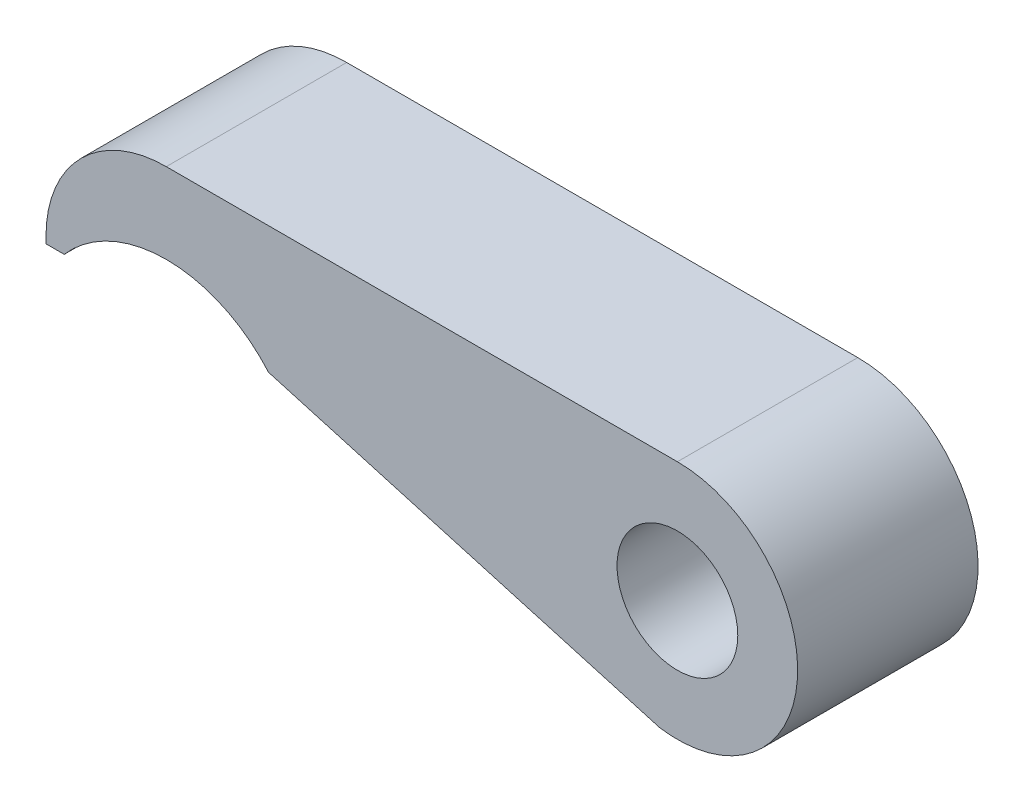
ISO-10303-21;
HEADER;
FILE_DESCRIPTION(('STEP AP214'),'2;1');
FILE_NAME('part.step','',(''),(''),'','','');
FILE_SCHEMA(('AUTOMOTIVE_DESIGN { 1 0 10303 214 1 1 1 1 }'));
ENDSEC;
DATA;
#1=APPLICATION_CONTEXT('core data for automotive mechanical design processes');
#2=APPLICATION_PROTOCOL_DEFINITION('international standard','automotive_design',2000,#1);
#3=PRODUCT_CONTEXT('',#1,'mechanical');
#4=PRODUCT('Part','Part','',(#3));
#5=PRODUCT_RELATED_PRODUCT_CATEGORY('part','',(#4));
#6=PRODUCT_DEFINITION_FORMATION('','',#4);
#7=PRODUCT_DEFINITION_CONTEXT('part definition',#1,'design');
#8=PRODUCT_DEFINITION('design','',#6,#7);
#9=PRODUCT_DEFINITION_SHAPE('','',#8);
#10=(LENGTH_UNIT() NAMED_UNIT(*) SI_UNIT(.MILLI.,.METRE.));
#11=(NAMED_UNIT(*) PLANE_ANGLE_UNIT() SI_UNIT($,.RADIAN.));
#12=(NAMED_UNIT(*) SI_UNIT($,.STERADIAN.) SOLID_ANGLE_UNIT());
#13=UNCERTAINTY_MEASURE_WITH_UNIT(LENGTH_MEASURE(1.E-05),#10,'distance_accuracy_value','');
#14=(GEOMETRIC_REPRESENTATION_CONTEXT(3) GLOBAL_UNCERTAINTY_ASSIGNED_CONTEXT((#13)) GLOBAL_UNIT_ASSIGNED_CONTEXT((#10,
#11,#12)) REPRESENTATION_CONTEXT('',''));
#15=CARTESIAN_POINT('',(0.,0.,0.));
#16=DIRECTION('',(0.,0.,1.));
#17=DIRECTION('',(1.,0.,0.));
#18=AXIS2_PLACEMENT_3D('',#15,#16,#17);
#19=CARTESIAN_POINT('',(-19.84375,-1.01600000000001,-9.525));
#20=DIRECTION('',(-1.,0.,0.));
#21=DIRECTION('',(0.,0.,1.));
#22=AXIS2_PLACEMENT_3D('',#19,#20,#21);
#23=PLANE('',#22);
#24=DIRECTION('',(0.,-1.,0.));
#25=VECTOR('',#24,1.);
#26=CARTESIAN_POINT('',(-19.84375,-1.01600000000001,0.));
#27=LINE('',#26,#25);
#28=CARTESIAN_POINT('',(-19.84375,-0.660400000000051,0.));
#29=VERTEX_POINT('',#28);
#30=CARTESIAN_POINT('',(-19.84375,-1.01600000000001,0.));
#31=VERTEX_POINT('',#30);
#32=EDGE_CURVE('E121',#29,#31,#27,.T.);
#33=ORIENTED_EDGE('',*,*,#32,.F.);
#34=DIRECTION('',(0.,0.,1.));
#35=VECTOR('',#34,1.);
#36=CARTESIAN_POINT('',(-19.84375,-0.660400000000051,-9.525));
#37=LINE('',#36,#35);
#38=CARTESIAN_POINT('',(-19.84375,-0.660400000000051,-9.525));
#39=VERTEX_POINT('',#38);
#40=EDGE_CURVE('E11',#39,#29,#37,.T.);
#41=ORIENTED_EDGE('',*,*,#40,.F.);
#42=DIRECTION('',(0.,-1.,0.));
#43=VECTOR('',#42,1.);
#44=CARTESIAN_POINT('',(-19.84375,-1.01600000000001,-9.525));
#45=LINE('',#44,#43);
#46=CARTESIAN_POINT('',(-19.84375,-1.01600000000001,-9.525));
#47=VERTEX_POINT('',#46);
#48=EDGE_CURVE('E139',#39,#47,#45,.T.);
#49=ORIENTED_EDGE('',*,*,#48,.T.);
#50=DIRECTION('',(0.,0.,1.));
#51=VECTOR('',#50,1.);
#52=CARTESIAN_POINT('',(-19.84375,-1.01600000000001,-9.525));
#53=LINE('',#52,#51);
#54=EDGE_CURVE('E33',#47,#31,#53,.T.);
#55=ORIENTED_EDGE('',*,*,#54,.T.);
#56=EDGE_LOOP('',(#33,#41,#49,#55));
#57=FACE_BOUND('',#56,.T.);
#58=ADVANCED_FACE('F30',(#57),#23,.T.);
#59=CARTESIAN_POINT('',(-13.49375,-0.660400000000006,-9.525));
#60=DIRECTION('',(0.,0.,1.));
#61=DIRECTION('',(1.,0.,0.));
#62=AXIS2_PLACEMENT_3D('',#59,#60,#61);
#63=CYLINDRICAL_SURFACE('',#62,6.35);
#64=CARTESIAN_POINT('',(-13.49375,-0.660400000000006,0.));
#65=DIRECTION('',(0.,0.,1.));
#66=DIRECTION('',(-1.,0.,0.));
#67=AXIS2_PLACEMENT_3D('',#64,#65,#66);
#68=CIRCLE('',#67,6.35);
#69=CARTESIAN_POINT('',(-13.49375,5.68959999999999,0.));
#70=VERTEX_POINT('',#69);
#71=EDGE_CURVE('E137',#70,#29,#68,.T.);
#72=ORIENTED_EDGE('',*,*,#71,.F.);
#73=DIRECTION('',(0.,0.,1.));
#74=VECTOR('',#73,1.);
#75=CARTESIAN_POINT('',(-13.49375,5.68959999999999,-9.525));
#76=LINE('',#75,#74);
#77=CARTESIAN_POINT('',(-13.49375,5.68959999999999,-9.525));
#78=VERTEX_POINT('',#77);
#79=EDGE_CURVE('E39',#78,#70,#76,.T.);
#80=ORIENTED_EDGE('',*,*,#79,.F.);
#81=CARTESIAN_POINT('',(-13.49375,-0.660400000000006,-9.525));
#82=DIRECTION('',(0.,0.,1.));
#83=DIRECTION('',(-1.,0.,0.));
#84=AXIS2_PLACEMENT_3D('',#81,#82,#83);
#85=CIRCLE('',#84,6.35);
#86=EDGE_CURVE('E111',#78,#39,#85,.T.);
#87=ORIENTED_EDGE('',*,*,#86,.T.);
#88=ORIENTED_EDGE('',*,*,#40,.T.);
#89=EDGE_LOOP('',(#72,#80,#87,#88));
#90=FACE_BOUND('',#89,.T.);
#91=ADVANCED_FACE('F149',(#90),#63,.T.);
#92=CARTESIAN_POINT('',(-13.49375,5.68959999999999,-9.525));
#93=DIRECTION('',(0.,1.,0.));
#94=DIRECTION('',(0.,0.,1.));
#95=AXIS2_PLACEMENT_3D('',#92,#93,#94);
#96=PLANE('',#95);
#97=DIRECTION('',(-1.,0.,0.));
#98=VECTOR('',#97,1.);
#99=CARTESIAN_POINT('',(-13.49375,5.68959999999999,0.));
#100=LINE('',#99,#98);
#101=CARTESIAN_POINT('',(13.49375,5.68959999999999,0.));
#102=VERTEX_POINT('',#101);
#103=EDGE_CURVE('E98',#102,#70,#100,.T.);
#104=ORIENTED_EDGE('',*,*,#103,.F.);
#105=DIRECTION('',(0.,0.,1.));
#106=VECTOR('',#105,1.);
#107=CARTESIAN_POINT('',(13.49375,5.68959999999999,-9.525));
#108=LINE('',#107,#106);
#109=CARTESIAN_POINT('',(13.49375,5.68959999999999,-9.525));
#110=VERTEX_POINT('',#109);
#111=EDGE_CURVE('E93',#110,#102,#108,.T.);
#112=ORIENTED_EDGE('',*,*,#111,.F.);
#113=DIRECTION('',(-1.,0.,0.));
#114=VECTOR('',#113,1.);
#115=CARTESIAN_POINT('',(-13.49375,5.68959999999999,-9.525));
#116=LINE('',#115,#114);
#117=EDGE_CURVE('E96',#110,#78,#116,.T.);
#118=ORIENTED_EDGE('',*,*,#117,.T.);
#119=ORIENTED_EDGE('',*,*,#79,.T.);
#120=EDGE_LOOP('',(#104,#112,#118,#119));
#121=FACE_BOUND('',#120,.T.);
#122=ADVANCED_FACE('F95',(#121),#96,.T.);
#123=CARTESIAN_POINT('',(13.49375,-0.660400000000009,-9.525));
#124=DIRECTION('',(0.,0.,1.));
#125=DIRECTION('',(1.,0.,0.));
#126=AXIS2_PLACEMENT_3D('',#123,#124,#125);
#127=CYLINDRICAL_SURFACE('',#126,6.35);
#128=CARTESIAN_POINT('',(13.49375,-0.660400000000009,0.));
#129=DIRECTION('',(0.,0.,1.));
#130=DIRECTION('',(-1.,0.,0.));
#131=AXIS2_PLACEMENT_3D('',#128,#129,#130);
#132=CIRCLE('',#131,6.35);
#133=CARTESIAN_POINT('',(12.5830786254703,-6.94475976433657,0.));
#134=VERTEX_POINT('',#133);
#135=EDGE_CURVE('E134',#134,#102,#132,.T.);
#136=ORIENTED_EDGE('',*,*,#135,.F.);
#137=DIRECTION('',(0.,0.,1.));
#138=VECTOR('',#137,1.);
#139=CARTESIAN_POINT('',(12.5830786254703,-6.94475976433657,-9.525));
#140=LINE('',#139,#138);
#141=CARTESIAN_POINT('',(12.5830786254703,-6.94475976433657,-9.525));
#142=VERTEX_POINT('',#141);
#143=EDGE_CURVE('E103',#142,#134,#140,.T.);
#144=ORIENTED_EDGE('',*,*,#143,.F.);
#145=CARTESIAN_POINT('',(13.49375,-0.660400000000009,-9.525));
#146=DIRECTION('',(0.,0.,1.));
#147=DIRECTION('',(-1.,0.,0.));
#148=AXIS2_PLACEMENT_3D('',#145,#146,#147);
#149=CIRCLE('',#148,6.35);
#150=EDGE_CURVE('E109',#142,#110,#149,.T.);
#151=ORIENTED_EDGE('',*,*,#150,.T.);
#152=ORIENTED_EDGE('',*,*,#111,.T.);
#153=EDGE_LOOP('',(#136,#144,#151,#152));
#154=FACE_BOUND('',#153,.T.);
#155=ADVANCED_FACE('F113',(#154),#127,.T.);
#156=CARTESIAN_POINT('',(-8.09296381073981,-1.01600000000001,-9.525));
#157=DIRECTION('',(-0.275637355817,-0.961261695938319,0.));
#158=DIRECTION('',(0.961261695938319,-0.275637355817,0.));
#159=AXIS2_PLACEMENT_3D('',#156,#157,#158);
#160=PLANE('',#159);
#161=DIRECTION('',(0.961261695938319,-0.275637355817,0.));
#162=VECTOR('',#161,1.);
#163=CARTESIAN_POINT('',(-8.09296381073981,-1.01600000000001,0.));
#164=LINE('',#163,#162);
#165=CARTESIAN_POINT('',(-8.09296381073981,-1.01600000000001,0.));
#166=VERTEX_POINT('',#165);
#167=EDGE_CURVE('E131',#166,#134,#164,.T.);
#168=ORIENTED_EDGE('',*,*,#167,.F.);
#169=DIRECTION('',(0.,0.,1.));
#170=VECTOR('',#169,1.);
#171=CARTESIAN_POINT('',(-8.09296381073981,-1.01600000000001,-9.525));
#172=LINE('',#171,#170);
#173=CARTESIAN_POINT('',(-8.09296381073981,-1.01600000000001,-9.525));
#174=VERTEX_POINT('',#173);
#175=EDGE_CURVE('E143',#174,#166,#172,.T.);
#176=ORIENTED_EDGE('',*,*,#175,.F.);
#177=DIRECTION('',(0.961261695938319,-0.275637355817,0.));
#178=VECTOR('',#177,1.);
#179=CARTESIAN_POINT('',(-8.09296381073981,-1.01600000000001,-9.525));
#180=LINE('',#179,#178);
#181=EDGE_CURVE('E114',#174,#142,#180,.T.);
#182=ORIENTED_EDGE('',*,*,#181,.T.);
#183=ORIENTED_EDGE('',*,*,#143,.T.);
#184=EDGE_LOOP('',(#168,#176,#182,#183));
#185=FACE_BOUND('',#184,.T.);
#186=ADVANCED_FACE('F162',(#185),#160,.T.);
#187=CARTESIAN_POINT('',(-13.4874,-5.68960000000001,-9.525));
#188=DIRECTION('',(0.,0.,1.));
#189=DIRECTION('',(1.,0.,0.));
#190=AXIS2_PLACEMENT_3D('',#187,#188,#189);
#191=CYLINDRICAL_SURFACE('',#190,7.1374);
#192=CARTESIAN_POINT('',(-13.4874,-5.68960000000001,0.));
#193=DIRECTION('',(0.,0.,-1.));
#194=DIRECTION('',(-1.,0.,0.));
#195=AXIS2_PLACEMENT_3D('',#192,#193,#194);
#196=CIRCLE('',#195,7.1374);
#197=CARTESIAN_POINT('',(-18.8818361892602,-1.01600000000001,0.));
#198=VERTEX_POINT('',#197);
#199=EDGE_CURVE('E128',#198,#166,#196,.T.);
#200=ORIENTED_EDGE('',*,*,#199,.F.);
#201=DIRECTION('',(0.,0.,1.));
#202=VECTOR('',#201,1.);
#203=CARTESIAN_POINT('',(-18.8818361892602,-1.01600000000001,-9.525));
#204=LINE('',#203,#202);
#205=CARTESIAN_POINT('',(-18.8818361892602,-1.01600000000001,-9.525));
#206=VERTEX_POINT('',#205);
#207=EDGE_CURVE('E144',#206,#198,#204,.T.);
#208=ORIENTED_EDGE('',*,*,#207,.F.);
#209=CARTESIAN_POINT('',(-13.4874,-5.68960000000001,-9.525));
#210=DIRECTION('',(0.,0.,-1.));
#211=DIRECTION('',(-1.,0.,0.));
#212=AXIS2_PLACEMENT_3D('',#209,#210,#211);
#213=CIRCLE('',#212,7.1374);
#214=EDGE_CURVE('E116',#206,#174,#213,.T.);
#215=ORIENTED_EDGE('',*,*,#214,.T.);
#216=ORIENTED_EDGE('',*,*,#175,.T.);
#217=EDGE_LOOP('',(#200,#208,#215,#216));
#218=FACE_BOUND('',#217,.T.);
#219=ADVANCED_FACE('F165',(#218),#191,.F.);
#220=CARTESIAN_POINT('',(-19.84375,-1.01600000000001,-9.525));
#221=DIRECTION('',(0.,-1.,0.));
#222=DIRECTION('',(1.,0.,0.));
#223=AXIS2_PLACEMENT_3D('',#220,#221,#222);
#224=PLANE('',#223);
#225=DIRECTION('',(1.,0.,0.));
#226=VECTOR('',#225,1.);
#227=CARTESIAN_POINT('',(-19.84375,-1.01600000000001,0.));
#228=LINE('',#227,#226);
#229=EDGE_CURVE('E124',#31,#198,#228,.T.);
#230=ORIENTED_EDGE('',*,*,#229,.F.);
#231=ORIENTED_EDGE('',*,*,#54,.F.);
#232=DIRECTION('',(1.,0.,0.));
#233=VECTOR('',#232,1.);
#234=CARTESIAN_POINT('',(-19.84375,-1.01600000000001,-9.525));
#235=LINE('',#234,#233);
#236=EDGE_CURVE('E194',#47,#206,#235,.T.);
#237=ORIENTED_EDGE('',*,*,#236,.T.);
#238=ORIENTED_EDGE('',*,*,#207,.T.);
#239=EDGE_LOOP('',(#230,#231,#237,#238));
#240=FACE_BOUND('',#239,.T.);
#241=ADVANCED_FACE('F146',(#240),#224,.T.);
#242=CARTESIAN_POINT('',(-13.49375,-0.660400000000006,-9.525));
#243=DIRECTION('',(0.,0.,-1.));
#244=DIRECTION('',(-1.,0.,0.));
#245=AXIS2_PLACEMENT_3D('',#242,#243,#244);
#246=PLANE('',#245);
#247=CARTESIAN_POINT('',(13.49375,-0.660400000000006,-9.525));
#248=DIRECTION('',(0.,0.,1.));
#249=DIRECTION('',(1.,0.,0.));
#250=AXIS2_PLACEMENT_3D('',#247,#248,#249);
#251=CIRCLE('',#250,3.1877);
#252=CARTESIAN_POINT('',(16.68145,-0.660400000000006,-9.525));
#253=VERTEX_POINT('',#252);
#254=EDGE_CURVE('E125',#253,#253,#251,.T.);
#255=ORIENTED_EDGE('',*,*,#254,.T.);
#256=EDGE_LOOP('',(#255));
#257=FACE_BOUND('',#256,.T.);
#258=ORIENTED_EDGE('',*,*,#48,.F.);
#259=ORIENTED_EDGE('',*,*,#86,.F.);
#260=ORIENTED_EDGE('',*,*,#117,.F.);
#261=ORIENTED_EDGE('',*,*,#150,.F.);
#262=ORIENTED_EDGE('',*,*,#181,.F.);
#263=ORIENTED_EDGE('',*,*,#214,.F.);
#264=ORIENTED_EDGE('',*,*,#236,.F.);
#265=EDGE_LOOP('',(#258,#259,#260,#261,#262,#263,#264));
#266=FACE_BOUND('',#265,.T.);
#267=ADVANCED_FACE('F107',(#257,#266),#246,.T.);
#268=CARTESIAN_POINT('',(-13.49375,-0.660400000000006,0.));
#269=DIRECTION('',(0.,0.,-1.));
#270=DIRECTION('',(-1.,0.,0.));
#271=AXIS2_PLACEMENT_3D('',#268,#269,#270);
#272=PLANE('',#271);
#273=CARTESIAN_POINT('',(13.49375,-0.660400000000006,0.));
#274=DIRECTION('',(0.,0.,1.));
#275=DIRECTION('',(1.,0.,0.));
#276=AXIS2_PLACEMENT_3D('',#273,#274,#275);
#277=CIRCLE('',#276,3.1877);
#278=CARTESIAN_POINT('',(16.68145,-0.660400000000006,0.));
#279=VERTEX_POINT('',#278);
#280=EDGE_CURVE('E189',#279,#279,#277,.T.);
#281=ORIENTED_EDGE('',*,*,#280,.F.);
#282=EDGE_LOOP('',(#281));
#283=FACE_BOUND('',#282,.T.);
#284=ORIENTED_EDGE('',*,*,#32,.T.);
#285=ORIENTED_EDGE('',*,*,#229,.T.);
#286=ORIENTED_EDGE('',*,*,#199,.T.);
#287=ORIENTED_EDGE('',*,*,#167,.T.);
#288=ORIENTED_EDGE('',*,*,#135,.T.);
#289=ORIENTED_EDGE('',*,*,#103,.T.);
#290=ORIENTED_EDGE('',*,*,#71,.T.);
#291=EDGE_LOOP('',(#284,#285,#286,#287,#288,#289,#290));
#292=FACE_BOUND('',#291,.T.);
#293=ADVANCED_FACE('F148',(#283,#292),#272,.F.);
#294=CARTESIAN_POINT('',(13.49375,-0.660400000000006,-9.525));
#295=DIRECTION('',(0.,0.,1.));
#296=DIRECTION('',(1.,0.,0.));
#297=AXIS2_PLACEMENT_3D('',#294,#295,#296);
#298=CYLINDRICAL_SURFACE('',#297,3.1877);
#299=CARTESIAN_POINT('',(16.68145,-0.660400000000006,-9.525));
#300=CARTESIAN_POINT('',(16.68145,-0.660400000000006,-9.42578125));
#301=CARTESIAN_POINT('',(16.68145,-0.660400000000006,-9.3265625));
#302=CARTESIAN_POINT('',(16.68145,-0.660400000000006,-9.128125));
#303=CARTESIAN_POINT('',(16.68145,-0.660400000000006,-9.02890625));
#304=CARTESIAN_POINT('',(16.68145,-0.660400000000006,-8.83046875));
#305=CARTESIAN_POINT('',(16.68145,-0.660400000000006,-8.73125));
#306=CARTESIAN_POINT('',(16.68145,-0.660400000000006,-8.5328125));
#307=CARTESIAN_POINT('',(16.68145,-0.660400000000006,-8.43359375));
#308=CARTESIAN_POINT('',(16.68145,-0.660400000000006,-8.23515625));
#309=CARTESIAN_POINT('',(16.68145,-0.660400000000006,-8.1359375));
#310=CARTESIAN_POINT('',(16.68145,-0.660400000000006,-7.9375));
#311=CARTESIAN_POINT('',(16.68145,-0.660400000000006,-7.83828125));
#312=CARTESIAN_POINT('',(16.68145,-0.660400000000006,-7.63984375));
#313=CARTESIAN_POINT('',(16.68145,-0.660400000000006,-7.540625));
#314=CARTESIAN_POINT('',(16.68145,-0.660400000000006,-7.3421875));
#315=CARTESIAN_POINT('',(16.68145,-0.660400000000006,-7.24296875));
#316=CARTESIAN_POINT('',(16.68145,-0.660400000000006,-7.04453125));
#317=CARTESIAN_POINT('',(16.68145,-0.660400000000006,-6.9453125));
#318=CARTESIAN_POINT('',(16.68145,-0.660400000000006,-6.746875));
#319=CARTESIAN_POINT('',(16.68145,-0.660400000000006,-6.64765625));
#320=CARTESIAN_POINT('',(16.68145,-0.660400000000006,-6.44921875));
#321=CARTESIAN_POINT('',(16.68145,-0.660400000000006,-6.35));
#322=CARTESIAN_POINT('',(16.68145,-0.660400000000006,-6.1515625));
#323=CARTESIAN_POINT('',(16.68145,-0.660400000000006,-6.05234375));
#324=CARTESIAN_POINT('',(16.68145,-0.660400000000006,-5.85390625));
#325=CARTESIAN_POINT('',(16.68145,-0.660400000000006,-5.7546875));
#326=CARTESIAN_POINT('',(16.68145,-0.660400000000006,-5.55625));
#327=CARTESIAN_POINT('',(16.68145,-0.660400000000006,-5.45703125));
#328=CARTESIAN_POINT('',(16.68145,-0.660400000000006,-5.25859375));
#329=CARTESIAN_POINT('',(16.68145,-0.660400000000006,-5.159375));
#330=CARTESIAN_POINT('',(16.68145,-0.660400000000006,-4.9609375));
#331=CARTESIAN_POINT('',(16.68145,-0.660400000000006,-4.86171875));
#332=CARTESIAN_POINT('',(16.68145,-0.660400000000006,-4.66328125));
#333=CARTESIAN_POINT('',(16.68145,-0.660400000000006,-4.5640625));
#334=CARTESIAN_POINT('',(16.68145,-0.660400000000006,-4.365625));
#335=CARTESIAN_POINT('',(16.68145,-0.660400000000006,-4.26640625));
#336=CARTESIAN_POINT('',(16.68145,-0.660400000000006,-4.06796875));
#337=CARTESIAN_POINT('',(16.68145,-0.660400000000006,-3.96875));
#338=CARTESIAN_POINT('',(16.68145,-0.660400000000006,-3.7703125));
#339=CARTESIAN_POINT('',(16.68145,-0.660400000000006,-3.67109375));
#340=CARTESIAN_POINT('',(16.68145,-0.660400000000006,-3.47265625));
#341=CARTESIAN_POINT('',(16.68145,-0.660400000000006,-3.3734375));
#342=CARTESIAN_POINT('',(16.68145,-0.660400000000006,-3.175));
#343=CARTESIAN_POINT('',(16.68145,-0.660400000000006,-3.07578125));
#344=CARTESIAN_POINT('',(16.68145,-0.660400000000006,-2.87734375));
#345=CARTESIAN_POINT('',(16.68145,-0.660400000000006,-2.778125));
#346=CARTESIAN_POINT('',(16.68145,-0.660400000000006,-2.5796875));
#347=CARTESIAN_POINT('',(16.68145,-0.660400000000006,-2.48046875));
#348=CARTESIAN_POINT('',(16.68145,-0.660400000000006,-2.28203125));
#349=CARTESIAN_POINT('',(16.68145,-0.660400000000006,-2.1828125));
#350=CARTESIAN_POINT('',(16.68145,-0.660400000000006,-1.984375));
#351=CARTESIAN_POINT('',(16.68145,-0.660400000000006,-1.88515625));
#352=CARTESIAN_POINT('',(16.68145,-0.660400000000006,-1.68671875));
#353=CARTESIAN_POINT('',(16.68145,-0.660400000000006,-1.5875));
#354=CARTESIAN_POINT('',(16.68145,-0.660400000000006,-1.3890625));
#355=CARTESIAN_POINT('',(16.68145,-0.660400000000006,-1.28984375));
#356=CARTESIAN_POINT('',(16.68145,-0.660400000000006,-1.09140625));
#357=CARTESIAN_POINT('',(16.68145,-0.660400000000006,-0.992187500000001));
#358=CARTESIAN_POINT('',(16.68145,-0.660400000000006,-0.793750000000001));
#359=CARTESIAN_POINT('',(16.68145,-0.660400000000006,-0.69453125));
#360=CARTESIAN_POINT('',(16.68145,-0.660400000000006,-0.49609375));
#361=CARTESIAN_POINT('',(16.68145,-0.660400000000006,-0.396875));
#362=CARTESIAN_POINT('',(16.68145,-0.660400000000006,-0.1984375));
#363=CARTESIAN_POINT('',(16.68145,-0.660400000000006,-0.0992187500000001));
#364=CARTESIAN_POINT('',(16.68145,-0.660400000000006,0.));
#365=B_SPLINE_CURVE_WITH_KNOTS('',3,(#299,#300,#301,#302,#303,#304,#305,#306,#307,#308,#309,
#310,#311,#312,#313,#314,#315,#316,#317,#318,#319,#320,#321,#322,#323,#324,#325,#326,#327,#328,
#329,#330,#331,#332,#333,#334,#335,#336,#337,#338,#339,#340,#341,#342,#343,#344,#345,#346,#347,
#348,#349,#350,#351,#352,#353,#354,#355,#356,#357,#358,#359,#360,#361,#362,#363,#364),
.UNSPECIFIED.,.F.,.F.,(4,2,2,2,2,2,2,2,2,2,2,2,2,2,2,2,2,2,2,2,2,2,2,2,2,2,2,2,2,2,2,2,4),(0.,
0.29765625,0.5953125,0.892968750000001,1.190625,1.48828125,1.7859375,2.08359375,2.38125,
2.67890625,2.9765625,3.27421875,3.571875,3.86953125,4.1671875,4.46484375,4.7625,5.06015625,
5.3578125,5.65546875,5.953125,6.25078125,6.5484375,6.84609375,7.14375,7.44140625,7.7390625,
8.03671875,8.334375,8.63203125,8.9296875,9.22734375,9.525),.UNSPECIFIED.);
#366=EDGE_CURVE('BSEAM177',#253,#279,#365,.T.);
#367=ORIENTED_EDGE('',*,*,#254,.F.);
#368=ORIENTED_EDGE('',*,*,#280,.T.);
#369=ORIENTED_EDGE('',*,*,#366,.T.);
#370=ORIENTED_EDGE('',*,*,#366,.F.);
#371=EDGE_LOOP('',(#367,#369,#368,#370));
#372=FACE_BOUND('',#371,.T.);
#373=ADVANCED_FACE('F177',(#372),#298,.F.);
#374=CLOSED_SHELL('',(#58,#91,#122,#155,#186,#219,#241,#267,#293,#373));
#375=MANIFOLD_SOLID_BREP('B2',#374);
#376=ADVANCED_BREP_SHAPE_REPRESENTATION('',(#18,#375),#14);
#377=SHAPE_DEFINITION_REPRESENTATION(#9,#376);
ENDSEC;
END-ISO-10303-21;
